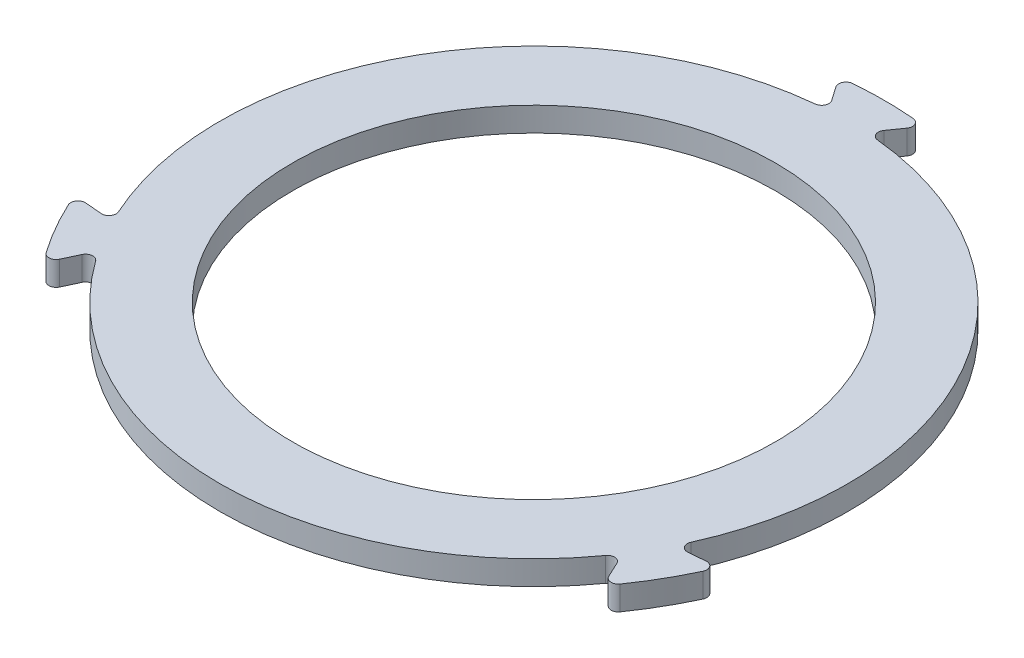
ISO-10303-21;
HEADER;
FILE_DESCRIPTION(('STEP AP214'),'2;1');
FILE_NAME('part.step','',(''),(''),'','','');
FILE_SCHEMA(('AUTOMOTIVE_DESIGN { 1 0 10303 214 1 1 1 1 }'));
ENDSEC;
DATA;
#1=APPLICATION_CONTEXT('core data for automotive mechanical design processes');
#2=APPLICATION_PROTOCOL_DEFINITION('international standard','automotive_design',2000,#1);
#3=PRODUCT_CONTEXT('',#1,'mechanical');
#4=PRODUCT('Part','Part','',(#3));
#5=PRODUCT_RELATED_PRODUCT_CATEGORY('part','',(#4));
#6=PRODUCT_DEFINITION_FORMATION('','',#4);
#7=PRODUCT_DEFINITION_CONTEXT('part definition',#1,'design');
#8=PRODUCT_DEFINITION('design','',#6,#7);
#9=PRODUCT_DEFINITION_SHAPE('','',#8);
#10=(LENGTH_UNIT() NAMED_UNIT(*) SI_UNIT(.MILLI.,.METRE.));
#11=(NAMED_UNIT(*) PLANE_ANGLE_UNIT() SI_UNIT($,.RADIAN.));
#12=(NAMED_UNIT(*) SI_UNIT($,.STERADIAN.) SOLID_ANGLE_UNIT());
#13=UNCERTAINTY_MEASURE_WITH_UNIT(LENGTH_MEASURE(1.E-05),#10,'distance_accuracy_value','');
#14=(GEOMETRIC_REPRESENTATION_CONTEXT(3) GLOBAL_UNCERTAINTY_ASSIGNED_CONTEXT((#13)) GLOBAL_UNIT_ASSIGNED_CONTEXT((#10,
#11,#12)) REPRESENTATION_CONTEXT('',''));
#15=CARTESIAN_POINT('',(0.,0.,0.));
#16=DIRECTION('',(0.,0.,1.));
#17=DIRECTION('',(1.,0.,0.));
#18=AXIS2_PLACEMENT_3D('',#15,#16,#17);
#19=CARTESIAN_POINT('',(0.,-0.750000000000001,0.));
#20=DIRECTION('',(0.,-1.,0.));
#21=DIRECTION('',(0.,0.,-1.));
#22=AXIS2_PLACEMENT_3D('',#19,#20,#21);
#23=CYLINDRICAL_SURFACE('',#22,65.);
#24=CARTESIAN_POINT('',(0.,5.,0.));
#25=DIRECTION('',(0.,-1.,0.));
#26=DIRECTION('',(0.,0.,-1.));
#27=AXIS2_PLACEMENT_3D('',#24,#25,#26);
#28=CIRCLE('',#27,65.);
#29=CARTESIAN_POINT('',(6.46386338980305,5.,-64.6778050808619));
#30=VERTEX_POINT('',#29);
#31=CARTESIAN_POINT('',(59.2445539559464,5.,26.7410326382688));
#32=VERTEX_POINT('',#31);
#33=EDGE_CURVE('E344',#30,#32,#28,.T.);
#34=ORIENTED_EDGE('',*,*,#33,.T.);
#35=DIRECTION('',(0.,-1.,0.));
#36=VECTOR('',#35,1.);
#37=CARTESIAN_POINT('',(59.2445539559464,-0.750000000000001,26.7410326382688));
#38=LINE('',#37,#36);
#39=CARTESIAN_POINT('',(59.2445539559464,0.,26.7410326382688));
#40=VERTEX_POINT('',#39);
#41=EDGE_CURVE('E299',#32,#40,#38,.T.);
#42=ORIENTED_EDGE('',*,*,#41,.T.);
#43=CARTESIAN_POINT('',(0.,0.,0.));
#44=DIRECTION('',(0.,-1.,0.));
#45=DIRECTION('',(0.,0.,-1.));
#46=AXIS2_PLACEMENT_3D('',#43,#44,#45);
#47=CIRCLE('',#46,65.);
#48=CARTESIAN_POINT('',(6.46386338980305,0.,-64.6778050808619));
#49=VERTEX_POINT('',#48);
#50=EDGE_CURVE('E227',#49,#40,#47,.T.);
#51=ORIENTED_EDGE('',*,*,#50,.F.);
#52=DIRECTION('',(0.,-1.,0.));
#53=VECTOR('',#52,1.);
#54=CARTESIAN_POINT('',(6.46386338980305,-0.750000000000001,-64.6778050808619));
#55=LINE('',#54,#53);
#56=EDGE_CURVE('E224',#49,#30,#55,.F.);
#57=ORIENTED_EDGE('',*,*,#56,.T.);
#58=EDGE_LOOP('',(#34,#42,#51,#57));
#59=FACE_BOUND('',#58,.T.);
#60=ADVANCED_FACE('F33',(#59),#23,.T.);
#61=CARTESIAN_POINT('',(52.7806905661435,0.,37.9367724425921));
#62=VERTEX_POINT('',#61);
#63=CARTESIAN_POINT('',(-52.7806905661429,0.,37.9367724425928));
#64=VERTEX_POINT('',#63);
#65=EDGE_CURVE('E339',#62,#64,#47,.T.);
#66=ORIENTED_EDGE('',*,*,#65,.F.);
#67=DIRECTION('',(0.,-1.,0.));
#68=VECTOR('',#67,1.);
#69=CARTESIAN_POINT('',(52.7806905661435,-0.750000000000001,37.9367724425921));
#70=LINE('',#69,#68);
#71=CARTESIAN_POINT('',(52.7806905661435,5.,37.9367724425921));
#72=VERTEX_POINT('',#71);
#73=EDGE_CURVE('E318',#62,#72,#70,.F.);
#74=ORIENTED_EDGE('',*,*,#73,.T.);
#75=CARTESIAN_POINT('',(-52.7806905661429,5.,37.9367724425928));
#76=VERTEX_POINT('',#75);
#77=EDGE_CURVE('E328',#72,#76,#28,.T.);
#78=ORIENTED_EDGE('',*,*,#77,.T.);
#79=DIRECTION('',(0.,-1.,0.));
#80=VECTOR('',#79,1.);
#81=CARTESIAN_POINT('',(-52.7806905661429,-0.750000000000001,37.9367724425928));
#82=LINE('',#81,#80);
#83=EDGE_CURVE('E261',#76,#64,#82,.T.);
#84=ORIENTED_EDGE('',*,*,#83,.T.);
#85=EDGE_LOOP('',(#66,#74,#78,#84));
#86=FACE_BOUND('',#85,.T.);
#87=ADVANCED_FACE('F338',(#86),#23,.T.);
#88=CARTESIAN_POINT('',(0.,-0.750000000000001,0.));
#89=DIRECTION('',(0.,-1.,0.));
#90=DIRECTION('',(0.,0.,-1.));
#91=AXIS2_PLACEMENT_3D('',#88,#89,#90);
#92=CYLINDRICAL_SURFACE('',#91,50.);
#93=CARTESIAN_POINT('',(0.,5.,0.));
#94=DIRECTION('',(0.,-1.,0.));
#95=DIRECTION('',(0.,0.,-1.));
#96=AXIS2_PLACEMENT_3D('',#93,#94,#95);
#97=CIRCLE('',#96,50.);
#98=CARTESIAN_POINT('',(0.,5.,-50.));
#99=VERTEX_POINT('',#98);
#100=EDGE_CURVE('E349',#99,#99,#97,.T.);
#101=ORIENTED_EDGE('',*,*,#100,.F.);
#102=EDGE_LOOP('',(#101));
#103=FACE_BOUND('',#102,.T.);
#104=CARTESIAN_POINT('',(0.,0.,0.));
#105=DIRECTION('',(0.,-1.,0.));
#106=DIRECTION('',(0.,0.,-1.));
#107=AXIS2_PLACEMENT_3D('',#104,#105,#106);
#108=CIRCLE('',#107,50.);
#109=CARTESIAN_POINT('',(0.,0.,-50.));
#110=VERTEX_POINT('',#109);
#111=EDGE_CURVE('E222',#110,#110,#108,.T.);
#112=ORIENTED_EDGE('',*,*,#111,.T.);
#113=EDGE_LOOP('',(#112));
#114=FACE_BOUND('',#113,.T.);
#115=ADVANCED_FACE('F485',(#103,#114),#92,.F.);
#116=CARTESIAN_POINT('',(0.,0.,50.));
#117=DIRECTION('',(0.,1.,0.));
#118=DIRECTION('',(0.,0.,1.));
#119=AXIS2_PLACEMENT_3D('',#116,#117,#118);
#120=PLANE('',#119);
#121=ORIENTED_EDGE('',*,*,#111,.F.);
#122=EDGE_LOOP('',(#121));
#123=FACE_BOUND('',#122,.T.);
#124=DIRECTION('',(-0.996194698091745,0.,0.0871557427476622));
#125=VECTOR('',#124,1.);
#126=CARTESIAN_POINT('',(58.1317926992566,0.,29.0808300701796));
#127=LINE('',#126,#125);
#128=CARTESIAN_POINT('',(64.1992009210775,0.,28.5500006337862));
#129=VERTEX_POINT('',#128);
#130=CARTESIAN_POINT('',(60.7424695844359,0.,28.8524254385972));
#131=VERTEX_POINT('',#130);
#132=EDGE_CURVE('E374',#129,#131,#127,.T.);
#133=ORIENTED_EDGE('',*,*,#132,.F.);
#134=CARTESIAN_POINT('',(64.329934535199,0.,30.0442926809239));
#135=DIRECTION('',(0.,1.,0.));
#136=DIRECTION('',(0.,0.,1.));
#137=AXIS2_PLACEMENT_3D('',#134,#135,#136);
#138=CIRCLE('',#137,1.5);
#139=CARTESIAN_POINT('',(65.6890176591821,0.,30.6790312586899));
#140=VERTEX_POINT('',#139);
#141=EDGE_CURVE('E311',#129,#140,#138,.F.);
#142=ORIENTED_EDGE('',*,*,#141,.T.);
#143=CARTESIAN_POINT('',(0.,0.,0.));
#144=DIRECTION('',(0.,1.,0.));
#145=DIRECTION('',(0.866025403784443,0.,0.499999999999992));
#146=AXIS2_PLACEMENT_3D('',#143,#144,#145);
#147=CIRCLE('',#146,72.5);
#148=CARTESIAN_POINT('',(59.4133292631141,0.,41.5488424131503));
#149=VERTEX_POINT('',#148);
#150=EDGE_CURVE('E389',#149,#140,#147,.T.);
#151=ORIENTED_EDGE('',*,*,#150,.F.);
#152=CARTESIAN_POINT('',(58.1840879680152,0.,40.6892111908092));
#153=DIRECTION('',(0.,1.,0.));
#154=DIRECTION('',(0.,0.,1.));
#155=AXIS2_PLACEMENT_3D('',#152,#153,#154);
#156=CIRCLE('',#155,1.5);
#157=CARTESIAN_POINT('',(56.8246262874602,0.,41.3231385834203));
#158=VERTEX_POINT('',#157);
#159=EDGE_CURVE('E52',#149,#158,#156,.F.);
#160=ORIENTED_EDGE('',*,*,#159,.T.);
#161=DIRECTION('',(0.422618261740713,0.,0.906307787036644));
#162=VECTOR('',#161,1.);
#163=CARTESIAN_POINT('',(57.9010744784291,0.,43.631589178523));
#164=LINE('',#163,#162);
#165=CARTESIAN_POINT('',(55.3581681828402,0.,38.1783090294255));
#166=VERTEX_POINT('',#165);
#167=EDGE_CURVE('E385',#166,#158,#164,.T.);
#168=ORIENTED_EDGE('',*,*,#167,.F.);
#169=CARTESIAN_POINT('',(53.9987065022852,0.,38.8122364220365));
#170=DIRECTION('',(0.,1.,0.));
#171=DIRECTION('',(0.,0.,1.));
#172=AXIS2_PLACEMENT_3D('',#169,#170,#171);
#173=CIRCLE('',#172,1.5);
#174=EDGE_CURVE('E11',#166,#62,#173,.T.);
#175=ORIENTED_EDGE('',*,*,#174,.T.);
#176=ORIENTED_EDGE('',*,*,#65,.T.);
#177=CARTESIAN_POINT('',(-53.9987065022847,0.,38.8122364220373));
#178=DIRECTION('',(0.,1.,0.));
#179=DIRECTION('',(0.,0.,1.));
#180=AXIS2_PLACEMENT_3D('',#177,#178,#179);
#181=CIRCLE('',#180,1.5);
#182=CARTESIAN_POINT('',(-55.3581681828397,0.,38.1783090294262));
#183=VERTEX_POINT('',#182);
#184=EDGE_CURVE('E288',#64,#183,#181,.T.);
#185=ORIENTED_EDGE('',*,*,#184,.T.);
#186=DIRECTION('',(0.4226182617407,0.,-0.90630778703665));
#187=VECTOR('',#186,1.);
#188=CARTESIAN_POINT('',(-54.2506339535424,0.,35.8031942099969));
#189=LINE('',#188,#187);
#190=CARTESIAN_POINT('',(-56.8246262874596,0.,41.3231385834211));
#191=VERTEX_POINT('',#190);
#192=EDGE_CURVE('E357',#191,#183,#189,.T.);
#193=ORIENTED_EDGE('',*,*,#192,.F.);
#194=CARTESIAN_POINT('',(-58.1840879680146,0.,40.68921119081));
#195=DIRECTION('',(0.,1.,0.));
#196=DIRECTION('',(0.,0.,1.));
#197=AXIS2_PLACEMENT_3D('',#194,#195,#196);
#198=CIRCLE('',#197,1.5);
#199=CARTESIAN_POINT('',(-59.4133292631135,0.,41.5488424131511));
#200=VERTEX_POINT('',#199);
#201=EDGE_CURVE('E275',#191,#200,#198,.F.);
#202=ORIENTED_EDGE('',*,*,#201,.T.);
#203=CARTESIAN_POINT('',(0.,0.,0.));
#204=DIRECTION('',(0.,1.,0.));
#205=DIRECTION('',(-0.866025403784436,0.,0.500000000000004));
#206=AXIS2_PLACEMENT_3D('',#203,#204,#205);
#207=CIRCLE('',#206,72.5);
#208=CARTESIAN_POINT('',(-65.6890176591816,0.,30.6790312586908));
#209=VERTEX_POINT('',#208);
#210=EDGE_CURVE('E377',#209,#200,#207,.T.);
#211=ORIENTED_EDGE('',*,*,#210,.F.);
#212=CARTESIAN_POINT('',(-64.3299345351986,0.,30.0442926809248));
#213=DIRECTION('',(0.,1.,0.));
#214=DIRECTION('',(0.,0.,1.));
#215=AXIS2_PLACEMENT_3D('',#212,#213,#214);
#216=CIRCLE('',#215,1.5);
#217=CARTESIAN_POINT('',(-64.1992009210771,0.,28.5500006337871));
#218=VERTEX_POINT('',#217);
#219=EDGE_CURVE('E273',#209,#218,#216,.F.);
#220=ORIENTED_EDGE('',*,*,#219,.T.);
#221=DIRECTION('',(-0.996194698091747,0.,-0.0871557427476483));
#222=VECTOR('',#221,1.);
#223=CARTESIAN_POINT('',(-66.7366018753018,0.,28.3280068154726));
#224=LINE('',#223,#222);
#225=CARTESIAN_POINT('',(-60.7424695844355,0.,28.8524254385981));
#226=VERTEX_POINT('',#225);
#227=EDGE_CURVE('E367',#226,#218,#224,.T.);
#228=ORIENTED_EDGE('',*,*,#227,.F.);
#229=CARTESIAN_POINT('',(-60.611735970314,0.,27.3581333914604));
#230=DIRECTION('',(0.,1.,0.));
#231=DIRECTION('',(0.,0.,1.));
#232=AXIS2_PLACEMENT_3D('',#229,#230,#231);
#233=CIRCLE('',#232,1.5);
#234=CARTESIAN_POINT('',(-59.244553955946,0.,26.7410326382696));
#235=VERTEX_POINT('',#234);
#236=EDGE_CURVE('E292',#226,#235,#233,.T.);
#237=ORIENTED_EDGE('',*,*,#236,.T.);
#238=CARTESIAN_POINT('',(-6.46386338980305,0.,-64.6778050808619));
#239=VERTEX_POINT('',#238);
#240=EDGE_CURVE('E342',#235,#239,#47,.T.);
#241=ORIENTED_EDGE('',*,*,#240,.T.);
#242=CARTESIAN_POINT('',(-6.61302946802927,0.,-66.1703698134972));
#243=DIRECTION('',(0.,1.,0.));
#244=DIRECTION('',(0.,0.,1.));
#245=AXIS2_PLACEMENT_3D('',#242,#243,#244);
#246=CIRCLE('',#245,1.5);
#247=CARTESIAN_POINT('',(-5.38430140159578,0.,-67.0307344680237));
#248=VERTEX_POINT('',#247);
#249=EDGE_CURVE('E250',#239,#248,#246,.T.);
#250=ORIENTED_EDGE('',*,*,#249,.T.);
#251=DIRECTION('',(0.573576436351042,0.,0.819152044288995));
#252=VECTOR('',#251,1.);
#253=CARTESIAN_POINT('',(-3.88115874571378,0.,-64.8840242801768));
#254=LINE('',#253,#252);
#255=CARTESIAN_POINT('',(-7.37457463361741,0.,-69.8731392172076));
#256=VERTEX_POINT('',#255);
#257=EDGE_CURVE('E351',#256,#248,#254,.T.);
#258=ORIENTED_EDGE('',*,*,#257,.F.);
#259=CARTESIAN_POINT('',(-6.14584656718391,0.,-70.7335038717342));
#260=DIRECTION('',(0.,1.,0.));
#261=DIRECTION('',(0.,0.,1.));
#262=AXIS2_PLACEMENT_3D('',#259,#260,#261);
#263=CIRCLE('',#262,1.5);
#264=CARTESIAN_POINT('',(-6.27568839606808,0.,-72.2278736718413));
#265=VERTEX_POINT('',#264);
#266=EDGE_CURVE('E221',#256,#265,#263,.F.);
#267=ORIENTED_EDGE('',*,*,#266,.T.);
#268=CARTESIAN_POINT('',(0.,0.,0.));
#269=DIRECTION('',(0.,1.,0.));
#270=DIRECTION('',(0.,0.,-1.));
#271=AXIS2_PLACEMENT_3D('',#268,#269,#270);
#272=CIRCLE('',#271,72.5);
#273=CARTESIAN_POINT('',(6.27568839606808,0.,-72.2278736718413));
#274=VERTEX_POINT('',#273);
#275=EDGE_CURVE('E359',#274,#265,#272,.T.);
#276=ORIENTED_EDGE('',*,*,#275,.F.);
#277=CARTESIAN_POINT('',(6.14584656718391,0.,-70.7335038717342));
#278=DIRECTION('',(0.,1.,0.));
#279=DIRECTION('',(0.,0.,1.));
#280=AXIS2_PLACEMENT_3D('',#277,#278,#279);
#281=CIRCLE('',#280,1.5);
#282=CARTESIAN_POINT('',(7.37457463361741,0.,-69.8731392172076));
#283=VERTEX_POINT('',#282);
#284=EDGE_CURVE('E206',#274,#283,#281,.F.);
#285=ORIENTED_EDGE('',*,*,#284,.T.);
#286=DIRECTION('',(0.573576436351042,0.,-0.819152044288995));
#287=VECTOR('',#286,1.);
#288=CARTESIAN_POINT('',(8.83552739687324,0.,-71.9595959939959));
#289=LINE('',#288,#287);
#290=CARTESIAN_POINT('',(5.38430140159578,0.,-67.0307344680237));
#291=VERTEX_POINT('',#290);
#292=EDGE_CURVE('E217',#291,#283,#289,.T.);
#293=ORIENTED_EDGE('',*,*,#292,.F.);
#294=CARTESIAN_POINT('',(6.61302946802927,0.,-66.1703698134972));
#295=DIRECTION('',(0.,1.,0.));
#296=DIRECTION('',(0.,0.,1.));
#297=AXIS2_PLACEMENT_3D('',#294,#295,#296);
#298=CIRCLE('',#297,1.5);
#299=EDGE_CURVE('E254',#291,#49,#298,.T.);
#300=ORIENTED_EDGE('',*,*,#299,.T.);
#301=ORIENTED_EDGE('',*,*,#50,.T.);
#302=CARTESIAN_POINT('',(60.6117359703144,0.,27.3581333914596));
#303=DIRECTION('',(0.,1.,0.));
#304=DIRECTION('',(0.,0.,1.));
#305=AXIS2_PLACEMENT_3D('',#302,#303,#304);
#306=CIRCLE('',#305,1.5);
#307=EDGE_CURVE('E323',#40,#131,#306,.T.);
#308=ORIENTED_EDGE('',*,*,#307,.T.);
#309=EDGE_LOOP('',(#133,#142,#151,#160,#168,#175,#176,#185,#193,#202,#211,#220,#228,#237,#241,
#250,#258,#267,#276,#285,#293,#300,#301,#308));
#310=FACE_BOUND('',#309,.T.);
#311=ADVANCED_FACE('F432',(#123,#310),#120,.F.);
#312=ORIENTED_EDGE('',*,*,#240,.F.);
#313=DIRECTION('',(0.,-1.,0.));
#314=VECTOR('',#313,1.);
#315=CARTESIAN_POINT('',(-59.244553955946,-0.750000000000001,26.7410326382696));
#316=LINE('',#315,#314);
#317=CARTESIAN_POINT('',(-59.244553955946,5.,26.7410326382696));
#318=VERTEX_POINT('',#317);
#319=EDGE_CURVE('E282',#235,#318,#316,.F.);
#320=ORIENTED_EDGE('',*,*,#319,.T.);
#321=CARTESIAN_POINT('',(-6.46386338980305,5.,-64.6778050808619));
#322=VERTEX_POINT('',#321);
#323=EDGE_CURVE('E348',#318,#322,#28,.T.);
#324=ORIENTED_EDGE('',*,*,#323,.T.);
#325=DIRECTION('',(0.,-1.,0.));
#326=VECTOR('',#325,1.);
#327=CARTESIAN_POINT('',(-6.46386338980305,-0.750000000000001,-64.6778050808619));
#328=LINE('',#327,#326);
#329=EDGE_CURVE('E233',#322,#239,#328,.T.);
#330=ORIENTED_EDGE('',*,*,#329,.T.);
#331=EDGE_LOOP('',(#312,#320,#324,#330));
#332=FACE_BOUND('',#331,.T.);
#333=ADVANCED_FACE('F441',(#332),#23,.T.);
#334=CARTESIAN_POINT('',(0.,5.,65.));
#335=DIRECTION('',(0.,-1.,0.));
#336=DIRECTION('',(0.,0.,-1.));
#337=AXIS2_PLACEMENT_3D('',#334,#335,#336);
#338=PLANE('',#337);
#339=CARTESIAN_POINT('',(0.,5.,0.));
#340=DIRECTION('',(0.,1.,0.));
#341=DIRECTION('',(0.866025403784443,0.,0.499999999999992));
#342=AXIS2_PLACEMENT_3D('',#339,#340,#341);
#343=CIRCLE('',#342,72.5);
#344=CARTESIAN_POINT('',(59.4133292631141,5.,41.5488424131503));
#345=VERTEX_POINT('',#344);
#346=CARTESIAN_POINT('',(65.6890176591821,5.,30.6790312586899));
#347=VERTEX_POINT('',#346);
#348=EDGE_CURVE('E335',#345,#347,#343,.T.);
#349=ORIENTED_EDGE('',*,*,#348,.T.);
#350=CARTESIAN_POINT('',(64.329934535199,5.,30.0442926809239));
#351=DIRECTION('',(0.,-1.,0.));
#352=DIRECTION('',(0.,0.,-1.));
#353=AXIS2_PLACEMENT_3D('',#350,#351,#352);
#354=CIRCLE('',#353,1.5);
#355=CARTESIAN_POINT('',(64.1992009210775,5.,28.5500006337862));
#356=VERTEX_POINT('',#355);
#357=EDGE_CURVE('E308',#347,#356,#354,.F.);
#358=ORIENTED_EDGE('',*,*,#357,.T.);
#359=DIRECTION('',(-0.996194698091745,0.,0.0871557427476622));
#360=VECTOR('',#359,1.);
#361=CARTESIAN_POINT('',(58.1317926992566,5.,29.0808300701796));
#362=LINE('',#361,#360);
#363=CARTESIAN_POINT('',(60.7424695844359,5.,28.8524254385972));
#364=VERTEX_POINT('',#363);
#365=EDGE_CURVE('E382',#356,#364,#362,.T.);
#366=ORIENTED_EDGE('',*,*,#365,.T.);
#367=CARTESIAN_POINT('',(60.6117359703144,5.,27.3581333914596));
#368=DIRECTION('',(0.,-1.,0.));
#369=DIRECTION('',(0.,0.,-1.));
#370=AXIS2_PLACEMENT_3D('',#367,#368,#369);
#371=CIRCLE('',#370,1.5);
#372=EDGE_CURVE('E321',#364,#32,#371,.T.);
#373=ORIENTED_EDGE('',*,*,#372,.T.);
#374=ORIENTED_EDGE('',*,*,#33,.F.);
#375=CARTESIAN_POINT('',(6.61302946802927,5.,-66.1703698134972));
#376=DIRECTION('',(0.,-1.,0.));
#377=DIRECTION('',(0.,0.,-1.));
#378=AXIS2_PLACEMENT_3D('',#375,#376,#377);
#379=CIRCLE('',#378,1.5);
#380=CARTESIAN_POINT('',(5.38430140159578,5.,-67.0307344680237));
#381=VERTEX_POINT('',#380);
#382=EDGE_CURVE('E252',#30,#381,#379,.T.);
#383=ORIENTED_EDGE('',*,*,#382,.T.);
#384=DIRECTION('',(0.573576436351042,0.,-0.819152044288995));
#385=VECTOR('',#384,1.);
#386=CARTESIAN_POINT('',(8.83552739687324,5.,-71.9595959939959));
#387=LINE('',#386,#385);
#388=CARTESIAN_POINT('',(7.37457463361741,5.,-69.8731392172076));
#389=VERTEX_POINT('',#388);
#390=EDGE_CURVE('E354',#381,#389,#387,.T.);
#391=ORIENTED_EDGE('',*,*,#390,.T.);
#392=CARTESIAN_POINT('',(6.14584656718391,5.,-70.7335038717342));
#393=DIRECTION('',(0.,-1.,0.));
#394=DIRECTION('',(0.,0.,-1.));
#395=AXIS2_PLACEMENT_3D('',#392,#393,#394);
#396=CIRCLE('',#395,1.5);
#397=CARTESIAN_POINT('',(6.27568839606808,5.,-72.2278736718413));
#398=VERTEX_POINT('',#397);
#399=EDGE_CURVE('E207',#389,#398,#396,.F.);
#400=ORIENTED_EDGE('',*,*,#399,.T.);
#401=CARTESIAN_POINT('',(0.,5.,0.));
#402=DIRECTION('',(0.,1.,0.));
#403=DIRECTION('',(0.,0.,-1.));
#404=AXIS2_PLACEMENT_3D('',#401,#402,#403);
#405=CIRCLE('',#404,72.5);
#406=CARTESIAN_POINT('',(-6.27568839606808,5.,-72.2278736718413));
#407=VERTEX_POINT('',#406);
#408=EDGE_CURVE('E201',#398,#407,#405,.T.);
#409=ORIENTED_EDGE('',*,*,#408,.T.);
#410=CARTESIAN_POINT('',(-6.14584656718391,5.,-70.7335038717342));
#411=DIRECTION('',(0.,-1.,0.));
#412=DIRECTION('',(0.,0.,-1.));
#413=AXIS2_PLACEMENT_3D('',#410,#411,#412);
#414=CIRCLE('',#413,1.5);
#415=CARTESIAN_POINT('',(-7.37457463361741,5.,-69.8731392172076));
#416=VERTEX_POINT('',#415);
#417=EDGE_CURVE('E193',#407,#416,#414,.F.);
#418=ORIENTED_EDGE('',*,*,#417,.T.);
#419=DIRECTION('',(0.573576436351042,0.,0.819152044288995));
#420=VECTOR('',#419,1.);
#421=CARTESIAN_POINT('',(-3.88115874571378,5.,-64.8840242801768));
#422=LINE('',#421,#420);
#423=CARTESIAN_POINT('',(-5.38430140159578,5.,-67.0307344680237));
#424=VERTEX_POINT('',#423);
#425=EDGE_CURVE('E199',#416,#424,#422,.T.);
#426=ORIENTED_EDGE('',*,*,#425,.T.);
#427=CARTESIAN_POINT('',(-6.61302946802927,5.,-66.1703698134972));
#428=DIRECTION('',(0.,-1.,0.));
#429=DIRECTION('',(0.,0.,-1.));
#430=AXIS2_PLACEMENT_3D('',#427,#428,#429);
#431=CIRCLE('',#430,1.5);
#432=EDGE_CURVE('E248',#424,#322,#431,.T.);
#433=ORIENTED_EDGE('',*,*,#432,.T.);
#434=ORIENTED_EDGE('',*,*,#323,.F.);
#435=CARTESIAN_POINT('',(-60.611735970314,5.,27.3581333914604));
#436=DIRECTION('',(0.,-1.,0.));
#437=DIRECTION('',(0.,0.,-1.));
#438=AXIS2_PLACEMENT_3D('',#435,#436,#437);
#439=CIRCLE('',#438,1.5);
#440=CARTESIAN_POINT('',(-60.7424695844355,5.,28.8524254385981));
#441=VERTEX_POINT('',#440);
#442=EDGE_CURVE('E290',#318,#441,#439,.T.);
#443=ORIENTED_EDGE('',*,*,#442,.T.);
#444=DIRECTION('',(-0.996194698091747,0.,-0.0871557427476483));
#445=VECTOR('',#444,1.);
#446=CARTESIAN_POINT('',(-66.7366018753018,5.,28.3280068154726));
#447=LINE('',#446,#445);
#448=CARTESIAN_POINT('',(-64.1992009210771,5.,28.5500006337871));
#449=VERTEX_POINT('',#448);
#450=EDGE_CURVE('E371',#441,#449,#447,.T.);
#451=ORIENTED_EDGE('',*,*,#450,.T.);
#452=CARTESIAN_POINT('',(-64.3299345351986,5.,30.0442926809248));
#453=DIRECTION('',(0.,-1.,0.));
#454=DIRECTION('',(0.,0.,-1.));
#455=AXIS2_PLACEMENT_3D('',#452,#453,#454);
#456=CIRCLE('',#455,1.5);
#457=CARTESIAN_POINT('',(-65.6890176591816,5.,30.6790312586908));
#458=VERTEX_POINT('',#457);
#459=EDGE_CURVE('E269',#449,#458,#456,.F.);
#460=ORIENTED_EDGE('',*,*,#459,.T.);
#461=CARTESIAN_POINT('',(0.,5.,0.));
#462=DIRECTION('',(0.,1.,0.));
#463=DIRECTION('',(-0.866025403784436,0.,0.500000000000004));
#464=AXIS2_PLACEMENT_3D('',#461,#462,#463);
#465=CIRCLE('',#464,72.5);
#466=CARTESIAN_POINT('',(-59.4133292631135,5.,41.5488424131511));
#467=VERTEX_POINT('',#466);
#468=EDGE_CURVE('E368',#458,#467,#465,.T.);
#469=ORIENTED_EDGE('',*,*,#468,.T.);
#470=CARTESIAN_POINT('',(-58.1840879680146,5.,40.68921119081));
#471=DIRECTION('',(0.,-1.,0.));
#472=DIRECTION('',(0.,0.,-1.));
#473=AXIS2_PLACEMENT_3D('',#470,#471,#472);
#474=CIRCLE('',#473,1.5);
#475=CARTESIAN_POINT('',(-56.8246262874596,5.,41.3231385834211));
#476=VERTEX_POINT('',#475);
#477=EDGE_CURVE('E271',#467,#476,#474,.F.);
#478=ORIENTED_EDGE('',*,*,#477,.T.);
#479=DIRECTION('',(0.4226182617407,0.,-0.90630778703665));
#480=VECTOR('',#479,1.);
#481=CARTESIAN_POINT('',(-54.2506339535424,5.,35.8031942099969));
#482=LINE('',#481,#480);
#483=CARTESIAN_POINT('',(-55.3581681828397,5.,38.1783090294262));
#484=VERTEX_POINT('',#483);
#485=EDGE_CURVE('E364',#476,#484,#482,.T.);
#486=ORIENTED_EDGE('',*,*,#485,.T.);
#487=CARTESIAN_POINT('',(-53.9987065022847,5.,38.8122364220373));
#488=DIRECTION('',(0.,-1.,0.));
#489=DIRECTION('',(0.,0.,-1.));
#490=AXIS2_PLACEMENT_3D('',#487,#488,#489);
#491=CIRCLE('',#490,1.5);
#492=EDGE_CURVE('E285',#484,#76,#491,.T.);
#493=ORIENTED_EDGE('',*,*,#492,.T.);
#494=ORIENTED_EDGE('',*,*,#77,.F.);
#495=CARTESIAN_POINT('',(53.9987065022852,5.,38.8122364220365));
#496=DIRECTION('',(0.,-1.,0.));
#497=DIRECTION('',(0.,0.,-1.));
#498=AXIS2_PLACEMENT_3D('',#495,#496,#497);
#499=CIRCLE('',#498,1.5);
#500=CARTESIAN_POINT('',(55.3581681828402,5.,38.1783090294255));
#501=VERTEX_POINT('',#500);
#502=EDGE_CURVE('E41',#72,#501,#499,.T.);
#503=ORIENTED_EDGE('',*,*,#502,.T.);
#504=DIRECTION('',(0.422618261740713,0.,0.906307787036644));
#505=VECTOR('',#504,1.);
#506=CARTESIAN_POINT('',(57.9010744784291,5.,43.631589178523));
#507=LINE('',#506,#505);
#508=CARTESIAN_POINT('',(56.8246262874602,5.,41.3231385834203));
#509=VERTEX_POINT('',#508);
#510=EDGE_CURVE('E327',#501,#509,#507,.T.);
#511=ORIENTED_EDGE('',*,*,#510,.T.);
#512=CARTESIAN_POINT('',(58.1840879680152,5.,40.6892111908092));
#513=DIRECTION('',(0.,-1.,0.));
#514=DIRECTION('',(0.,0.,-1.));
#515=AXIS2_PLACEMENT_3D('',#512,#513,#514);
#516=CIRCLE('',#515,1.5);
#517=EDGE_CURVE('E306',#509,#345,#516,.F.);
#518=ORIENTED_EDGE('',*,*,#517,.T.);
#519=EDGE_LOOP('',(#349,#358,#366,#373,#374,#383,#391,#400,#409,#418,#426,#433,#434,#443,#451,
#460,#469,#478,#486,#493,#494,#503,#511,#518));
#520=FACE_BOUND('',#519,.T.);
#521=ORIENTED_EDGE('',*,*,#100,.T.);
#522=EDGE_LOOP('',(#521));
#523=FACE_BOUND('',#522,.T.);
#524=ADVANCED_FACE('F196',(#520,#523),#338,.F.);
#525=CARTESIAN_POINT('',(-3.88115874571378,0.,-64.8840242801768));
#526=DIRECTION('',(-0.819152044288995,0.,0.573576436351042));
#527=DIRECTION('',(0.573576436351042,0.,0.819152044288995));
#528=AXIS2_PLACEMENT_3D('',#525,#526,#527);
#529=PLANE('',#528);
#530=ORIENTED_EDGE('',*,*,#257,.T.);
#531=DIRECTION('',(0.,-1.,0.));
#532=VECTOR('',#531,1.);
#533=CARTESIAN_POINT('',(-5.38430140159578,0.,-67.0307344680237));
#534=LINE('',#533,#532);
#535=EDGE_CURVE('E216',#248,#424,#534,.F.);
#536=ORIENTED_EDGE('',*,*,#535,.T.);
#537=ORIENTED_EDGE('',*,*,#425,.F.);
#538=DIRECTION('',(0.,1.,0.));
#539=VECTOR('',#538,1.);
#540=CARTESIAN_POINT('',(-7.37457463361741,0.,-69.8731392172076));
#541=LINE('',#540,#539);
#542=EDGE_CURVE('E213',#416,#256,#541,.F.);
#543=ORIENTED_EDGE('',*,*,#542,.T.);
#544=EDGE_LOOP('',(#530,#536,#537,#543));
#545=FACE_BOUND('',#544,.T.);
#546=ADVANCED_FACE('F212',(#545),#529,.T.);
#547=CARTESIAN_POINT('',(0.,0.,0.));
#548=DIRECTION('',(0.,1.,0.));
#549=DIRECTION('',(0.,0.,1.));
#550=AXIS2_PLACEMENT_3D('',#547,#548,#549);
#551=CYLINDRICAL_SURFACE('',#550,72.5);
#552=ORIENTED_EDGE('',*,*,#275,.T.);
#553=DIRECTION('',(0.,1.,0.));
#554=VECTOR('',#553,1.);
#555=CARTESIAN_POINT('',(-6.27568839606808,0.,-72.2278736718413));
#556=LINE('',#555,#554);
#557=EDGE_CURVE('E238',#265,#407,#556,.T.);
#558=ORIENTED_EDGE('',*,*,#557,.T.);
#559=ORIENTED_EDGE('',*,*,#408,.F.);
#560=DIRECTION('',(0.,1.,0.));
#561=VECTOR('',#560,1.);
#562=CARTESIAN_POINT('',(6.27568839606808,0.,-72.2278736718413));
#563=LINE('',#562,#561);
#564=EDGE_CURVE('E236',#398,#274,#563,.F.);
#565=ORIENTED_EDGE('',*,*,#564,.T.);
#566=EDGE_LOOP('',(#552,#558,#559,#565));
#567=FACE_BOUND('',#566,.T.);
#568=ADVANCED_FACE('F430',(#567),#551,.T.);
#569=CARTESIAN_POINT('',(8.83552739687324,0.,-71.9595959939959));
#570=DIRECTION('',(0.819152044288995,0.,0.573576436351042));
#571=DIRECTION('',(0.573576436351042,0.,-0.819152044288995));
#572=AXIS2_PLACEMENT_3D('',#569,#570,#571);
#573=PLANE('',#572);
#574=ORIENTED_EDGE('',*,*,#292,.T.);
#575=DIRECTION('',(0.,1.,0.));
#576=VECTOR('',#575,1.);
#577=CARTESIAN_POINT('',(7.37457463361741,0.,-69.8731392172076));
#578=LINE('',#577,#576);
#579=EDGE_CURVE('E245',#283,#389,#578,.T.);
#580=ORIENTED_EDGE('',*,*,#579,.T.);
#581=ORIENTED_EDGE('',*,*,#390,.F.);
#582=DIRECTION('',(0.,-1.,0.));
#583=VECTOR('',#582,1.);
#584=CARTESIAN_POINT('',(5.38430140159578,0.,-67.0307344680237));
#585=LINE('',#584,#583);
#586=EDGE_CURVE('E243',#381,#291,#585,.T.);
#587=ORIENTED_EDGE('',*,*,#586,.T.);
#588=EDGE_LOOP('',(#574,#580,#581,#587));
#589=FACE_BOUND('',#588,.T.);
#590=ADVANCED_FACE('F422',(#589),#573,.T.);
#591=CARTESIAN_POINT('',(-6.61302946802927,-0.750000000000001,-66.1703698134972));
#592=DIRECTION('',(0.,-1.,0.));
#593=DIRECTION('',(0.,0.,-1.));
#594=AXIS2_PLACEMENT_3D('',#591,#592,#593);
#595=CYLINDRICAL_SURFACE('',#594,1.5);
#596=ORIENTED_EDGE('',*,*,#249,.F.);
#597=ORIENTED_EDGE('',*,*,#329,.F.);
#598=ORIENTED_EDGE('',*,*,#432,.F.);
#599=ORIENTED_EDGE('',*,*,#535,.F.);
#600=EDGE_LOOP('',(#596,#597,#598,#599));
#601=FACE_BOUND('',#600,.T.);
#602=ADVANCED_FACE('F435',(#601),#595,.F.);
#603=CARTESIAN_POINT('',(-6.14584656718391,0.,-70.7335038717342));
#604=DIRECTION('',(0.,1.,0.));
#605=DIRECTION('',(0.,0.,1.));
#606=AXIS2_PLACEMENT_3D('',#603,#604,#605);
#607=CYLINDRICAL_SURFACE('',#606,1.5);
#608=ORIENTED_EDGE('',*,*,#266,.F.);
#609=ORIENTED_EDGE('',*,*,#542,.F.);
#610=ORIENTED_EDGE('',*,*,#417,.F.);
#611=ORIENTED_EDGE('',*,*,#557,.F.);
#612=EDGE_LOOP('',(#608,#609,#610,#611));
#613=FACE_BOUND('',#612,.T.);
#614=ADVANCED_FACE('F220',(#613),#607,.T.);
#615=CARTESIAN_POINT('',(6.14584656718391,0.,-70.7335038717342));
#616=DIRECTION('',(0.,1.,0.));
#617=DIRECTION('',(0.,0.,1.));
#618=AXIS2_PLACEMENT_3D('',#615,#616,#617);
#619=CYLINDRICAL_SURFACE('',#618,1.5);
#620=ORIENTED_EDGE('',*,*,#284,.F.);
#621=ORIENTED_EDGE('',*,*,#564,.F.);
#622=ORIENTED_EDGE('',*,*,#399,.F.);
#623=ORIENTED_EDGE('',*,*,#579,.F.);
#624=EDGE_LOOP('',(#620,#621,#622,#623));
#625=FACE_BOUND('',#624,.T.);
#626=ADVANCED_FACE('F427',(#625),#619,.T.);
#627=CARTESIAN_POINT('',(6.61302946802927,-0.750000000000001,-66.1703698134972));
#628=DIRECTION('',(0.,-1.,0.));
#629=DIRECTION('',(0.,0.,-1.));
#630=AXIS2_PLACEMENT_3D('',#627,#628,#629);
#631=CYLINDRICAL_SURFACE('',#630,1.5);
#632=ORIENTED_EDGE('',*,*,#299,.F.);
#633=ORIENTED_EDGE('',*,*,#586,.F.);
#634=ORIENTED_EDGE('',*,*,#382,.F.);
#635=ORIENTED_EDGE('',*,*,#56,.F.);
#636=EDGE_LOOP('',(#632,#633,#634,#635));
#637=FACE_BOUND('',#636,.T.);
#638=ADVANCED_FACE('F418',(#637),#631,.F.);
#639=CARTESIAN_POINT('',(-54.2506339535424,0.,35.8031942099969));
#640=DIRECTION('',(0.90630778703665,0.,0.4226182617407));
#641=DIRECTION('',(0.4226182617407,0.,-0.90630778703665));
#642=AXIS2_PLACEMENT_3D('',#639,#640,#641);
#643=PLANE('',#642);
#644=ORIENTED_EDGE('',*,*,#192,.T.);
#645=DIRECTION('',(0.,-1.,0.));
#646=VECTOR('',#645,1.);
#647=CARTESIAN_POINT('',(-55.3581681828397,0.,38.1783090294262));
#648=LINE('',#647,#646);
#649=EDGE_CURVE('E258',#183,#484,#648,.F.);
#650=ORIENTED_EDGE('',*,*,#649,.T.);
#651=ORIENTED_EDGE('',*,*,#485,.F.);
#652=DIRECTION('',(0.,1.,0.));
#653=VECTOR('',#652,1.);
#654=CARTESIAN_POINT('',(-56.8246262874596,0.,41.3231385834211));
#655=LINE('',#654,#653);
#656=EDGE_CURVE('E256',#476,#191,#655,.F.);
#657=ORIENTED_EDGE('',*,*,#656,.T.);
#658=EDGE_LOOP('',(#644,#650,#651,#657));
#659=FACE_BOUND('',#658,.T.);
#660=ADVANCED_FACE('F466',(#659),#643,.T.);
#661=CARTESIAN_POINT('',(0.,0.,0.));
#662=DIRECTION('',(0.,1.,0.));
#663=DIRECTION('',(0.,0.,1.));
#664=AXIS2_PLACEMENT_3D('',#661,#662,#663);
#665=CYLINDRICAL_SURFACE('',#664,72.5);
#666=ORIENTED_EDGE('',*,*,#210,.T.);
#667=DIRECTION('',(0.,1.,0.));
#668=VECTOR('',#667,1.);
#669=CARTESIAN_POINT('',(-59.4133292631135,0.,41.5488424131511));
#670=LINE('',#669,#668);
#671=EDGE_CURVE('E266',#200,#467,#670,.T.);
#672=ORIENTED_EDGE('',*,*,#671,.T.);
#673=ORIENTED_EDGE('',*,*,#468,.F.);
#674=DIRECTION('',(0.,1.,0.));
#675=VECTOR('',#674,1.);
#676=CARTESIAN_POINT('',(-65.6890176591817,0.,30.6790312586908));
#677=LINE('',#676,#675);
#678=EDGE_CURVE('E264',#458,#209,#677,.F.);
#679=ORIENTED_EDGE('',*,*,#678,.T.);
#680=EDGE_LOOP('',(#666,#672,#673,#679));
#681=FACE_BOUND('',#680,.T.);
#682=ADVANCED_FACE('F458',(#681),#665,.T.);
#683=CARTESIAN_POINT('',(-66.7366018753018,0.,28.3280068154726));
#684=DIRECTION('',(0.0871557427476483,0.,-0.996194698091747));
#685=DIRECTION('',(-0.996194698091747,0.,-0.0871557427476483));
#686=AXIS2_PLACEMENT_3D('',#683,#684,#685);
#687=PLANE('',#686);
#688=ORIENTED_EDGE('',*,*,#227,.T.);
#689=DIRECTION('',(0.,1.,0.));
#690=VECTOR('',#689,1.);
#691=CARTESIAN_POINT('',(-64.1992009210771,0.,28.5500006337871));
#692=LINE('',#691,#690);
#693=EDGE_CURVE('E279',#218,#449,#692,.T.);
#694=ORIENTED_EDGE('',*,*,#693,.T.);
#695=ORIENTED_EDGE('',*,*,#450,.F.);
#696=DIRECTION('',(0.,-1.,0.));
#697=VECTOR('',#696,1.);
#698=CARTESIAN_POINT('',(-60.7424695844355,0.,28.8524254385981));
#699=LINE('',#698,#697);
#700=EDGE_CURVE('E277',#441,#226,#699,.T.);
#701=ORIENTED_EDGE('',*,*,#700,.T.);
#702=EDGE_LOOP('',(#688,#694,#695,#701));
#703=FACE_BOUND('',#702,.T.);
#704=ADVANCED_FACE('F449',(#703),#687,.T.);
#705=CARTESIAN_POINT('',(58.1317926992566,0.,29.0808300701796));
#706=DIRECTION('',(-0.0871557427476622,0.,-0.996194698091745));
#707=DIRECTION('',(-0.996194698091745,0.,0.0871557427476622));
#708=AXIS2_PLACEMENT_3D('',#705,#706,#707);
#709=PLANE('',#708);
#710=ORIENTED_EDGE('',*,*,#132,.T.);
#711=DIRECTION('',(0.,-1.,0.));
#712=VECTOR('',#711,1.);
#713=CARTESIAN_POINT('',(60.7424695844359,0.,28.8524254385972));
#714=LINE('',#713,#712);
#715=EDGE_CURVE('E296',#131,#364,#714,.F.);
#716=ORIENTED_EDGE('',*,*,#715,.T.);
#717=ORIENTED_EDGE('',*,*,#365,.F.);
#718=DIRECTION('',(0.,1.,0.));
#719=VECTOR('',#718,1.);
#720=CARTESIAN_POINT('',(64.1992009210775,0.,28.5500006337862));
#721=LINE('',#720,#719);
#722=EDGE_CURVE('E294',#356,#129,#721,.F.);
#723=ORIENTED_EDGE('',*,*,#722,.T.);
#724=EDGE_LOOP('',(#710,#716,#717,#723));
#725=FACE_BOUND('',#724,.T.);
#726=ADVANCED_FACE('F405',(#725),#709,.T.);
#727=CARTESIAN_POINT('',(0.,0.,0.));
#728=DIRECTION('',(0.,1.,0.));
#729=DIRECTION('',(0.,0.,1.));
#730=AXIS2_PLACEMENT_3D('',#727,#728,#729);
#731=CYLINDRICAL_SURFACE('',#730,72.5);
#732=ORIENTED_EDGE('',*,*,#150,.T.);
#733=DIRECTION('',(0.,1.,0.));
#734=VECTOR('',#733,1.);
#735=CARTESIAN_POINT('',(65.6890176591821,0.,30.6790312586899));
#736=LINE('',#735,#734);
#737=EDGE_CURVE('E303',#140,#347,#736,.T.);
#738=ORIENTED_EDGE('',*,*,#737,.T.);
#739=ORIENTED_EDGE('',*,*,#348,.F.);
#740=DIRECTION('',(0.,1.,0.));
#741=VECTOR('',#740,1.);
#742=CARTESIAN_POINT('',(59.4133292631141,0.,41.5488424131503));
#743=LINE('',#742,#741);
#744=EDGE_CURVE('E301',#345,#149,#743,.F.);
#745=ORIENTED_EDGE('',*,*,#744,.T.);
#746=EDGE_LOOP('',(#732,#738,#739,#745));
#747=FACE_BOUND('',#746,.T.);
#748=ADVANCED_FACE('F397',(#747),#731,.T.);
#749=CARTESIAN_POINT('',(57.9010744784291,0.,43.631589178523));
#750=DIRECTION('',(-0.906307787036644,0.,0.422618261740713));
#751=DIRECTION('',(0.422618261740713,0.,0.906307787036644));
#752=AXIS2_PLACEMENT_3D('',#749,#750,#751);
#753=PLANE('',#752);
#754=ORIENTED_EDGE('',*,*,#167,.T.);
#755=DIRECTION('',(0.,1.,0.));
#756=VECTOR('',#755,1.);
#757=CARTESIAN_POINT('',(56.8246262874602,0.,41.3231385834203));
#758=LINE('',#757,#756);
#759=EDGE_CURVE('E315',#158,#509,#758,.T.);
#760=ORIENTED_EDGE('',*,*,#759,.T.);
#761=ORIENTED_EDGE('',*,*,#510,.F.);
#762=DIRECTION('',(0.,-1.,0.));
#763=VECTOR('',#762,1.);
#764=CARTESIAN_POINT('',(55.3581681828402,0.,38.1783090294255));
#765=LINE('',#764,#763);
#766=EDGE_CURVE('E313',#501,#166,#765,.T.);
#767=ORIENTED_EDGE('',*,*,#766,.T.);
#768=EDGE_LOOP('',(#754,#760,#761,#767));
#769=FACE_BOUND('',#768,.T.);
#770=ADVANCED_FACE('F333',(#769),#753,.T.);
#771=CARTESIAN_POINT('',(-53.9987065022847,-0.750000000000001,38.8122364220373));
#772=DIRECTION('',(0.,-1.,0.));
#773=DIRECTION('',(0.,0.,-1.));
#774=AXIS2_PLACEMENT_3D('',#771,#772,#773);
#775=CYLINDRICAL_SURFACE('',#774,1.5);
#776=ORIENTED_EDGE('',*,*,#184,.F.);
#777=ORIENTED_EDGE('',*,*,#83,.F.);
#778=ORIENTED_EDGE('',*,*,#492,.F.);
#779=ORIENTED_EDGE('',*,*,#649,.F.);
#780=EDGE_LOOP('',(#776,#777,#778,#779));
#781=FACE_BOUND('',#780,.T.);
#782=ADVANCED_FACE('F470',(#781),#775,.F.);
#783=CARTESIAN_POINT('',(-58.1840879680146,0.,40.68921119081));
#784=DIRECTION('',(0.,1.,0.));
#785=DIRECTION('',(0.,0.,1.));
#786=AXIS2_PLACEMENT_3D('',#783,#784,#785);
#787=CYLINDRICAL_SURFACE('',#786,1.5);
#788=ORIENTED_EDGE('',*,*,#201,.F.);
#789=ORIENTED_EDGE('',*,*,#656,.F.);
#790=ORIENTED_EDGE('',*,*,#477,.F.);
#791=ORIENTED_EDGE('',*,*,#671,.F.);
#792=EDGE_LOOP('',(#788,#789,#790,#791));
#793=FACE_BOUND('',#792,.T.);
#794=ADVANCED_FACE('F462',(#793),#787,.T.);
#795=CARTESIAN_POINT('',(-64.3299345351986,0.,30.0442926809248));
#796=DIRECTION('',(0.,1.,0.));
#797=DIRECTION('',(0.,0.,1.));
#798=AXIS2_PLACEMENT_3D('',#795,#796,#797);
#799=CYLINDRICAL_SURFACE('',#798,1.5);
#800=ORIENTED_EDGE('',*,*,#219,.F.);
#801=ORIENTED_EDGE('',*,*,#678,.F.);
#802=ORIENTED_EDGE('',*,*,#459,.F.);
#803=ORIENTED_EDGE('',*,*,#693,.F.);
#804=EDGE_LOOP('',(#800,#801,#802,#803));
#805=FACE_BOUND('',#804,.T.);
#806=ADVANCED_FACE('F455',(#805),#799,.T.);
#807=CARTESIAN_POINT('',(-60.611735970314,-0.750000000000001,27.3581333914604));
#808=DIRECTION('',(0.,-1.,0.));
#809=DIRECTION('',(0.,0.,-1.));
#810=AXIS2_PLACEMENT_3D('',#807,#808,#809);
#811=CYLINDRICAL_SURFACE('',#810,1.5);
#812=ORIENTED_EDGE('',*,*,#236,.F.);
#813=ORIENTED_EDGE('',*,*,#700,.F.);
#814=ORIENTED_EDGE('',*,*,#442,.F.);
#815=ORIENTED_EDGE('',*,*,#319,.F.);
#816=EDGE_LOOP('',(#812,#813,#814,#815));
#817=FACE_BOUND('',#816,.T.);
#818=ADVANCED_FACE('F445',(#817),#811,.F.);
#819=CARTESIAN_POINT('',(60.6117359703144,-0.750000000000001,27.3581333914596));
#820=DIRECTION('',(0.,-1.,0.));
#821=DIRECTION('',(0.,0.,-1.));
#822=AXIS2_PLACEMENT_3D('',#819,#820,#821);
#823=CYLINDRICAL_SURFACE('',#822,1.5);
#824=ORIENTED_EDGE('',*,*,#307,.F.);
#825=ORIENTED_EDGE('',*,*,#41,.F.);
#826=ORIENTED_EDGE('',*,*,#372,.F.);
#827=ORIENTED_EDGE('',*,*,#715,.F.);
#828=EDGE_LOOP('',(#824,#825,#826,#827));
#829=FACE_BOUND('',#828,.T.);
#830=ADVANCED_FACE('F410',(#829),#823,.F.);
#831=CARTESIAN_POINT('',(64.329934535199,0.,30.0442926809239));
#832=DIRECTION('',(0.,1.,0.));
#833=DIRECTION('',(0.,0.,1.));
#834=AXIS2_PLACEMENT_3D('',#831,#832,#833);
#835=CYLINDRICAL_SURFACE('',#834,1.5);
#836=ORIENTED_EDGE('',*,*,#141,.F.);
#837=ORIENTED_EDGE('',*,*,#722,.F.);
#838=ORIENTED_EDGE('',*,*,#357,.F.);
#839=ORIENTED_EDGE('',*,*,#737,.F.);
#840=EDGE_LOOP('',(#836,#837,#838,#839));
#841=FACE_BOUND('',#840,.T.);
#842=ADVANCED_FACE('F401',(#841),#835,.T.);
#843=CARTESIAN_POINT('',(58.1840879680152,0.,40.6892111908092));
#844=DIRECTION('',(0.,1.,0.));
#845=DIRECTION('',(0.,0.,1.));
#846=AXIS2_PLACEMENT_3D('',#843,#844,#845);
#847=CYLINDRICAL_SURFACE('',#846,1.5);
#848=ORIENTED_EDGE('',*,*,#159,.F.);
#849=ORIENTED_EDGE('',*,*,#744,.F.);
#850=ORIENTED_EDGE('',*,*,#517,.F.);
#851=ORIENTED_EDGE('',*,*,#759,.F.);
#852=EDGE_LOOP('',(#848,#849,#850,#851));
#853=FACE_BOUND('',#852,.T.);
#854=ADVANCED_FACE('F393',(#853),#847,.T.);
#855=CARTESIAN_POINT('',(53.9987065022852,-0.750000000000001,38.8122364220365));
#856=DIRECTION('',(0.,-1.,0.));
#857=DIRECTION('',(0.,0.,-1.));
#858=AXIS2_PLACEMENT_3D('',#855,#856,#857);
#859=CYLINDRICAL_SURFACE('',#858,1.5);
#860=ORIENTED_EDGE('',*,*,#174,.F.);
#861=ORIENTED_EDGE('',*,*,#766,.F.);
#862=ORIENTED_EDGE('',*,*,#502,.F.);
#863=ORIENTED_EDGE('',*,*,#73,.F.);
#864=EDGE_LOOP('',(#860,#861,#862,#863));
#865=FACE_BOUND('',#864,.T.);
#866=ADVANCED_FACE('F35',(#865),#859,.F.);
#867=CLOSED_SHELL('',(#60,#87,#115,#311,#333,#524,#546,#568,#590,#602,#614,#626,#638,#660,#682,
#704,#726,#748,#770,#782,#794,#806,#818,#830,#842,#854,#866));
#868=MANIFOLD_SOLID_BREP('B2',#867);
#869=ADVANCED_BREP_SHAPE_REPRESENTATION('',(#18,#868),#14);
#870=SHAPE_DEFINITION_REPRESENTATION(#9,#869);
ENDSEC;
END-ISO-10303-21;
